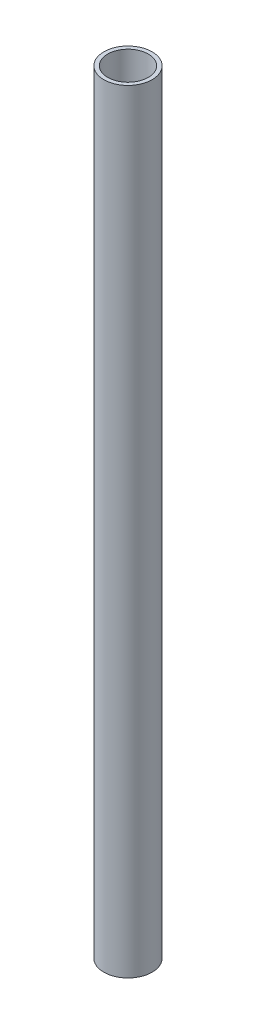
ISO-10303-21;
HEADER;
FILE_DESCRIPTION(('STEP AP214'),'2;1');
FILE_NAME('part.step','',(''),(''),'','','');
FILE_SCHEMA(('AUTOMOTIVE_DESIGN { 1 0 10303 214 1 1 1 1 }'));
ENDSEC;
DATA;
#1=APPLICATION_CONTEXT('core data for automotive mechanical design processes');
#2=APPLICATION_PROTOCOL_DEFINITION('international standard','automotive_design',2000,#1);
#3=PRODUCT_CONTEXT('',#1,'mechanical');
#4=PRODUCT('Part','Part','',(#3));
#5=PRODUCT_RELATED_PRODUCT_CATEGORY('part','',(#4));
#6=PRODUCT_DEFINITION_FORMATION('','',#4);
#7=PRODUCT_DEFINITION_CONTEXT('part definition',#1,'design');
#8=PRODUCT_DEFINITION('design','',#6,#7);
#9=PRODUCT_DEFINITION_SHAPE('','',#8);
#10=(LENGTH_UNIT() NAMED_UNIT(*) SI_UNIT(.MILLI.,.METRE.));
#11=(NAMED_UNIT(*) PLANE_ANGLE_UNIT() SI_UNIT($,.RADIAN.));
#12=(NAMED_UNIT(*) SI_UNIT($,.STERADIAN.) SOLID_ANGLE_UNIT());
#13=UNCERTAINTY_MEASURE_WITH_UNIT(LENGTH_MEASURE(1.E-05),#10,'distance_accuracy_value','');
#14=(GEOMETRIC_REPRESENTATION_CONTEXT(3) GLOBAL_UNCERTAINTY_ASSIGNED_CONTEXT((#13)) GLOBAL_UNIT_ASSIGNED_CONTEXT((#10,
#11,#12)) REPRESENTATION_CONTEXT('',''));
#15=CARTESIAN_POINT('',(0.,0.,0.));
#16=DIRECTION('',(0.,0.,1.));
#17=DIRECTION('',(1.,0.,0.));
#18=AXIS2_PLACEMENT_3D('',#15,#16,#17);
#19=CARTESIAN_POINT('',(0.,400.,0.));
#20=DIRECTION('',(0.,1.,0.));
#21=DIRECTION('',(0.,0.,1.));
#22=AXIS2_PLACEMENT_3D('',#19,#20,#21);
#23=PLANE('',#22);
#24=CARTESIAN_POINT('',(0.,400.,0.));
#25=DIRECTION('',(0.,1.,0.));
#26=DIRECTION('',(0.,0.,1.));
#27=AXIS2_PLACEMENT_3D('',#24,#25,#26);
#28=CIRCLE('',#27,12.5);
#29=CARTESIAN_POINT('',(0.,400.,12.5));
#30=VERTEX_POINT('',#29);
#31=EDGE_CURVE('E10',#30,#30,#28,.T.);
#32=ORIENTED_EDGE('',*,*,#31,.T.);
#33=EDGE_LOOP('',(#32));
#34=FACE_BOUND('',#33,.T.);
#35=CARTESIAN_POINT('',(0.,400.,0.));
#36=DIRECTION('',(0.,1.,0.));
#37=DIRECTION('',(0.,0.,1.));
#38=AXIS2_PLACEMENT_3D('',#35,#36,#37);
#39=CIRCLE('',#38,10.5);
#40=CARTESIAN_POINT('',(0.,400.,10.5));
#41=VERTEX_POINT('',#40);
#42=EDGE_CURVE('E42',#41,#41,#39,.T.);
#43=ORIENTED_EDGE('',*,*,#42,.F.);
#44=EDGE_LOOP('',(#43));
#45=FACE_BOUND('',#44,.T.);
#46=ADVANCED_FACE('F31',(#34,#45),#23,.T.);
#47=CARTESIAN_POINT('',(0.,0.,0.));
#48=DIRECTION('',(0.,1.,0.));
#49=DIRECTION('',(0.,0.,1.));
#50=AXIS2_PLACEMENT_3D('',#47,#48,#49);
#51=PLANE('',#50);
#52=CARTESIAN_POINT('',(0.,0.,0.));
#53=DIRECTION('',(0.,1.,0.));
#54=DIRECTION('',(0.,0.,1.));
#55=AXIS2_PLACEMENT_3D('',#52,#53,#54);
#56=CIRCLE('',#55,12.5);
#57=CARTESIAN_POINT('',(0.,0.,12.5));
#58=VERTEX_POINT('',#57);
#59=EDGE_CURVE('E35',#58,#58,#56,.T.);
#60=ORIENTED_EDGE('',*,*,#59,.F.);
#61=EDGE_LOOP('',(#60));
#62=FACE_BOUND('',#61,.T.);
#63=CARTESIAN_POINT('',(0.,0.,0.));
#64=DIRECTION('',(0.,1.,0.));
#65=DIRECTION('',(0.,0.,1.));
#66=AXIS2_PLACEMENT_3D('',#63,#64,#65);
#67=CIRCLE('',#66,10.5);
#68=CARTESIAN_POINT('',(0.,0.,10.5));
#69=VERTEX_POINT('',#68);
#70=EDGE_CURVE('E44',#69,#69,#67,.T.);
#71=ORIENTED_EDGE('',*,*,#70,.T.);
#72=EDGE_LOOP('',(#71));
#73=FACE_BOUND('',#72,.T.);
#74=ADVANCED_FACE('F54',(#62,#73),#51,.F.);
#75=CARTESIAN_POINT('',(0.,400.,0.));
#76=DIRECTION('',(0.,-1.,0.));
#77=DIRECTION('',(0.,0.,-1.));
#78=AXIS2_PLACEMENT_3D('',#75,#76,#77);
#79=CYLINDRICAL_SURFACE('',#78,12.5);
#80=ORIENTED_EDGE('',*,*,#31,.F.);
#81=EDGE_LOOP('',(#80));
#82=FACE_BOUND('',#81,.T.);
#83=ORIENTED_EDGE('',*,*,#59,.T.);
#84=EDGE_LOOP('',(#83));
#85=FACE_BOUND('',#84,.T.);
#86=ADVANCED_FACE('F33',(#82,#85),#79,.T.);
#87=CARTESIAN_POINT('',(0.,400.,0.));
#88=DIRECTION('',(0.,-1.,0.));
#89=DIRECTION('',(0.,0.,-1.));
#90=AXIS2_PLACEMENT_3D('',#87,#88,#89);
#91=CYLINDRICAL_SURFACE('',#90,10.5);
#92=ORIENTED_EDGE('',*,*,#42,.T.);
#93=EDGE_LOOP('',(#92));
#94=FACE_BOUND('',#93,.T.);
#95=ORIENTED_EDGE('',*,*,#70,.F.);
#96=EDGE_LOOP('',(#95));
#97=FACE_BOUND('',#96,.T.);
#98=ADVANCED_FACE('F50',(#94,#97),#91,.F.);
#99=CLOSED_SHELL('',(#46,#74,#86,#98));
#100=MANIFOLD_SOLID_BREP('B2',#99);
#101=ADVANCED_BREP_SHAPE_REPRESENTATION('',(#18,#100),#14);
#102=SHAPE_DEFINITION_REPRESENTATION(#9,#101);
ENDSEC;
END-ISO-10303-21;
